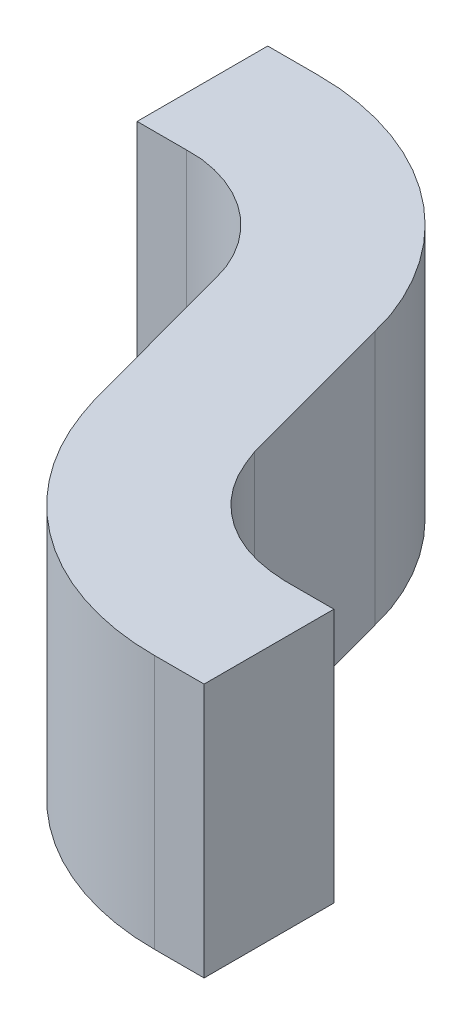
ISO-10303-21;
HEADER;
FILE_DESCRIPTION(('STEP AP214'),'2;1');
FILE_NAME('part.step','',(''),(''),'','','');
FILE_SCHEMA(('AUTOMOTIVE_DESIGN { 1 0 10303 214 1 1 1 1 }'));
ENDSEC;
DATA;
#1=APPLICATION_CONTEXT('core data for automotive mechanical design processes');
#2=APPLICATION_PROTOCOL_DEFINITION('international standard','automotive_design',2000,#1);
#3=PRODUCT_CONTEXT('',#1,'mechanical');
#4=PRODUCT('Part','Part','',(#3));
#5=PRODUCT_RELATED_PRODUCT_CATEGORY('part','',(#4));
#6=PRODUCT_DEFINITION_FORMATION('','',#4);
#7=PRODUCT_DEFINITION_CONTEXT('part definition',#1,'design');
#8=PRODUCT_DEFINITION('design','',#6,#7);
#9=PRODUCT_DEFINITION_SHAPE('','',#8);
#10=(LENGTH_UNIT() NAMED_UNIT(*) SI_UNIT(.MILLI.,.METRE.));
#11=(NAMED_UNIT(*) PLANE_ANGLE_UNIT() SI_UNIT($,.RADIAN.));
#12=(NAMED_UNIT(*) SI_UNIT($,.STERADIAN.) SOLID_ANGLE_UNIT());
#13=UNCERTAINTY_MEASURE_WITH_UNIT(LENGTH_MEASURE(1.E-05),#10,'distance_accuracy_value','');
#14=(GEOMETRIC_REPRESENTATION_CONTEXT(3) GLOBAL_UNCERTAINTY_ASSIGNED_CONTEXT((#13)) GLOBAL_UNIT_ASSIGNED_CONTEXT((#10,
#11,#12)) REPRESENTATION_CONTEXT('',''));
#15=CARTESIAN_POINT('',(0.,0.,0.));
#16=DIRECTION('',(0.,0.,1.));
#17=DIRECTION('',(1.,0.,0.));
#18=AXIS2_PLACEMENT_3D('',#15,#16,#17);
#19=CARTESIAN_POINT('',(-1.054,-0.152,0.543));
#20=DIRECTION('',(1.,0.,0.));
#21=DIRECTION('',(0.,0.,1.));
#22=AXIS2_PLACEMENT_3D('',#19,#20,#21);
#23=PLANE('',#22);
#24=DIRECTION('',(0.,-1.,0.));
#25=VECTOR('',#24,1.);
#26=CARTESIAN_POINT('',(-1.054,0.152,0.543));
#27=LINE('',#26,#25);
#28=CARTESIAN_POINT('',(-1.054,0.152,0.543));
#29=VERTEX_POINT('',#28);
#30=CARTESIAN_POINT('',(-1.054,-0.152,0.543));
#31=VERTEX_POINT('',#30);
#32=EDGE_CURVE('E11',#29,#31,#27,.T.);
#33=ORIENTED_EDGE('',*,*,#32,.F.);
#34=DIRECTION('',(0.,0.,-1.));
#35=VECTOR('',#34,1.);
#36=CARTESIAN_POINT('',(-1.054,0.152,0.698));
#37=LINE('',#36,#35);
#38=CARTESIAN_POINT('',(-1.054,0.152,0.698));
#39=VERTEX_POINT('',#38);
#40=EDGE_CURVE('E24',#39,#29,#37,.T.);
#41=ORIENTED_EDGE('',*,*,#40,.F.);
#42=DIRECTION('',(0.,1.,0.));
#43=VECTOR('',#42,1.);
#44=CARTESIAN_POINT('',(-1.054,-0.152,0.698));
#45=LINE('',#44,#43);
#46=CARTESIAN_POINT('',(-1.054,-0.152,0.698));
#47=VERTEX_POINT('',#46);
#48=EDGE_CURVE('E439',#47,#39,#45,.T.);
#49=ORIENTED_EDGE('',*,*,#48,.F.);
#50=DIRECTION('',(0.,0.,1.));
#51=VECTOR('',#50,1.);
#52=CARTESIAN_POINT('',(-1.054,-0.152,0.543));
#53=LINE('',#52,#51);
#54=EDGE_CURVE('E437',#31,#47,#53,.T.);
#55=ORIENTED_EDGE('',*,*,#54,.F.);
#56=EDGE_LOOP('',(#33,#41,#49,#55));
#57=FACE_BOUND('',#56,.T.);
#58=ADVANCED_FACE('F17',(#57),#23,.T.);
#59=CARTESIAN_POINT('',(-1.054,-0.152,0.698));
#60=DIRECTION('',(0.,0.,1.));
#61=DIRECTION('',(0.,1.,0.));
#62=AXIS2_PLACEMENT_3D('',#59,#60,#61);
#63=PLANE('',#62);
#64=ORIENTED_EDGE('',*,*,#48,.T.);
#65=DIRECTION('',(1.,0.,0.));
#66=VECTOR('',#65,1.);
#67=CARTESIAN_POINT('',(-1.113,0.152,0.698));
#68=LINE('',#67,#66);
#69=CARTESIAN_POINT('',(-1.113,0.152,0.698));
#70=VERTEX_POINT('',#69);
#71=EDGE_CURVE('E435',#70,#39,#68,.T.);
#72=ORIENTED_EDGE('',*,*,#71,.F.);
#73=CARTESIAN_POINT('',(-1.113,-0.152,0.69815));
#74=DIRECTION('',(0.,1.,0.));
#75=VECTOR('',#74,1.);
#76=LINE('',#73,#75);
#77=CARTESIAN_POINT('',(-1.113,-0.152,0.698));
#78=VERTEX_POINT('',#77);
#79=EDGE_CURVE('E257',#78,#70,#76,.T.);
#80=ORIENTED_EDGE('',*,*,#79,.F.);
#81=DIRECTION('',(-1.,0.,0.));
#82=VECTOR('',#81,1.);
#83=CARTESIAN_POINT('',(-1.054,-0.152,0.698));
#84=LINE('',#83,#82);
#85=EDGE_CURVE('E247',#47,#78,#84,.T.);
#86=ORIENTED_EDGE('',*,*,#85,.F.);
#87=EDGE_LOOP('',(#64,#72,#80,#86));
#88=FACE_BOUND('',#87,.T.);
#89=ADVANCED_FACE('F237',(#88),#63,.T.);
#90=CARTESIAN_POINT('',(-1.054,0.152,0.543));
#91=DIRECTION('',(0.,0.,-1.));
#92=DIRECTION('',(0.,1.,0.));
#93=AXIS2_PLACEMENT_3D('',#90,#91,#92);
#94=PLANE('',#93);
#95=ORIENTED_EDGE('',*,*,#32,.T.);
#96=DIRECTION('',(1.,0.,0.));
#97=VECTOR('',#96,1.);
#98=CARTESIAN_POINT('',(-1.113,-0.152,0.543));
#99=LINE('',#98,#97);
#100=CARTESIAN_POINT('',(-1.113,-0.152,0.543));
#101=VERTEX_POINT('',#100);
#102=EDGE_CURVE('E443',#101,#31,#99,.T.);
#103=ORIENTED_EDGE('',*,*,#102,.F.);
#104=CARTESIAN_POINT('',(-1.113,0.152,0.542575));
#105=DIRECTION('',(0.,-1.,0.));
#106=VECTOR('',#105,1.);
#107=LINE('',#104,#106);
#108=CARTESIAN_POINT('',(-1.113,0.152,0.543));
#109=VERTEX_POINT('',#108);
#110=EDGE_CURVE('E222',#109,#101,#107,.T.);
#111=ORIENTED_EDGE('',*,*,#110,.F.);
#112=DIRECTION('',(-1.,0.,0.));
#113=VECTOR('',#112,1.);
#114=CARTESIAN_POINT('',(-1.054,0.152,0.543));
#115=LINE('',#114,#113);
#116=EDGE_CURVE('E219',#29,#109,#115,.T.);
#117=ORIENTED_EDGE('',*,*,#116,.F.);
#118=EDGE_LOOP('',(#95,#103,#111,#117));
#119=FACE_BOUND('',#118,.T.);
#120=ADVANCED_FACE('F228',(#119),#94,.T.);
#121=CARTESIAN_POINT('',(-1.467,0.152,0.271));
#122=DIRECTION('',(-0.965885549343203,0.,0.258969313954337));
#123=DIRECTION('',(0.258969313954337,0.,0.965885549343203));
#124=AXIS2_PLACEMENT_3D('',#121,#122,#123);
#125=PLANE('',#124);
#126=CARTESIAN_POINT('',(-1.46667799927154,-0.152,0.270914133139076));
#127=DIRECTION('',(0.,1.,0.));
#128=VECTOR('',#127,1.);
#129=LINE('',#126,#128);
#130=CARTESIAN_POINT('',(-1.467,-0.152,0.271));
#131=VERTEX_POINT('',#130);
#132=CARTESIAN_POINT('',(-1.467,0.152,0.271));
#133=VERTEX_POINT('',#132);
#134=EDGE_CURVE('E215',#131,#133,#129,.T.);
#135=ORIENTED_EDGE('',*,*,#134,.F.);
#136=CARTESIAN_POINT('',(-1.414,-0.152,0.468));
#137=DIRECTION('',(-0.258969313954337,0.,-0.965885549343202));
#138=VECTOR('',#137,1.);
#139=LINE('',#136,#138);
#140=CARTESIAN_POINT('',(-1.414,-0.152,0.468));
#141=VERTEX_POINT('',#140);
#142=EDGE_CURVE('E301',#141,#131,#139,.T.);
#143=ORIENTED_EDGE('',*,*,#142,.F.);
#144=CARTESIAN_POINT('',(-1.41346097901335,0.152,0.467854947840802));
#145=DIRECTION('',(0.,-1.,0.));
#146=VECTOR('',#145,1.);
#147=LINE('',#144,#146);
#148=CARTESIAN_POINT('',(-1.414,0.152,0.468));
#149=VERTEX_POINT('',#148);
#150=EDGE_CURVE('E288',#149,#141,#147,.T.);
#151=ORIENTED_EDGE('',*,*,#150,.F.);
#152=DIRECTION('',(0.258969313954337,0.,0.965885549343203));
#153=VECTOR('',#152,1.);
#154=CARTESIAN_POINT('',(-1.467,0.152,0.271));
#155=LINE('',#154,#153);
#156=EDGE_CURVE('E356',#133,#149,#155,.T.);
#157=ORIENTED_EDGE('',*,*,#156,.F.);
#158=EDGE_LOOP('',(#135,#143,#151,#157));
#159=FACE_BOUND('',#158,.T.);
#160=ADVANCED_FACE('F236',(#159),#125,.T.);
#161=CARTESIAN_POINT('',(-1.317,-0.152,0.231));
#162=DIRECTION('',(0.965885549343203,0.,-0.258969313954337));
#163=DIRECTION('',(0.258969313954337,0.,0.965885549343203));
#164=AXIS2_PLACEMENT_3D('',#161,#162,#163);
#165=PLANE('',#164);
#166=CARTESIAN_POINT('',(-1.31635599854307,0.152,0.230828266278153));
#167=DIRECTION('',(0.,-1.,0.));
#168=VECTOR('',#167,1.);
#169=LINE('',#166,#168);
#170=CARTESIAN_POINT('',(-1.317,0.152,0.231));
#171=VERTEX_POINT('',#170);
#172=CARTESIAN_POINT('',(-1.317,-0.152,0.231));
#173=VERTEX_POINT('',#172);
#174=EDGE_CURVE('E342',#171,#173,#169,.T.);
#175=ORIENTED_EDGE('',*,*,#174,.F.);
#176=CARTESIAN_POINT('',(-1.264,0.152,0.428));
#177=DIRECTION('',(-0.258969313954337,0.,-0.965885549343202));
#178=VECTOR('',#177,1.);
#179=LINE('',#176,#178);
#180=CARTESIAN_POINT('',(-1.264,0.152,0.428));
#181=VERTEX_POINT('',#180);
#182=EDGE_CURVE('E330',#181,#171,#179,.T.);
#183=ORIENTED_EDGE('',*,*,#182,.F.);
#184=CARTESIAN_POINT('',(-1.2631389278252,-0.152,0.427766198945916));
#185=DIRECTION('',(0.,1.,0.));
#186=VECTOR('',#185,1.);
#187=LINE('',#184,#186);
#188=CARTESIAN_POINT('',(-1.264,-0.152,0.428));
#189=VERTEX_POINT('',#188);
#190=EDGE_CURVE('E366',#189,#181,#187,.T.);
#191=ORIENTED_EDGE('',*,*,#190,.F.);
#192=DIRECTION('',(0.258969313954337,0.,0.965885549343203));
#193=VECTOR('',#192,1.);
#194=CARTESIAN_POINT('',(-1.317,-0.152,0.231));
#195=LINE('',#194,#193);
#196=EDGE_CURVE('E368',#173,#189,#195,.T.);
#197=ORIENTED_EDGE('',*,*,#196,.F.);
#198=EDGE_LOOP('',(#175,#183,#191,#197));
#199=FACE_BOUND('',#198,.T.);
#200=ADVANCED_FACE('F160',(#199),#165,.T.);
#201=CARTESIAN_POINT('',(-1.676,0.152,0.156));
#202=DIRECTION('',(0.,0.,1.));
#203=DIRECTION('',(0.,1.,0.));
#204=AXIS2_PLACEMENT_3D('',#201,#202,#203);
#205=PLANE('',#204);
#206=DIRECTION('',(0.,1.,0.));
#207=VECTOR('',#206,1.);
#208=CARTESIAN_POINT('',(-1.676,-0.152,0.156));
#209=LINE('',#208,#207);
#210=CARTESIAN_POINT('',(-1.676,-0.152,0.156));
#211=VERTEX_POINT('',#210);
#212=CARTESIAN_POINT('',(-1.676,0.152,0.156));
#213=VERTEX_POINT('',#212);
#214=EDGE_CURVE('E125',#211,#213,#209,.T.);
#215=ORIENTED_EDGE('',*,*,#214,.F.);
#216=DIRECTION('',(-1.,0.,0.));
#217=VECTOR('',#216,1.);
#218=CARTESIAN_POINT('',(-1.617,-0.152,0.156));
#219=LINE('',#218,#217);
#220=CARTESIAN_POINT('',(-1.617,-0.152,0.156));
#221=VERTEX_POINT('',#220);
#222=EDGE_CURVE('E377',#221,#211,#219,.T.);
#223=ORIENTED_EDGE('',*,*,#222,.F.);
#224=CARTESIAN_POINT('',(-1.617,0.152,0.155425));
#225=DIRECTION('',(0.,-1.,0.));
#226=VECTOR('',#225,1.);
#227=LINE('',#224,#226);
#228=CARTESIAN_POINT('',(-1.617,0.152,0.156));
#229=VERTEX_POINT('',#228);
#230=EDGE_CURVE('E178',#229,#221,#227,.T.);
#231=ORIENTED_EDGE('',*,*,#230,.F.);
#232=DIRECTION('',(1.,0.,0.));
#233=VECTOR('',#232,1.);
#234=CARTESIAN_POINT('',(-1.676,0.152,0.156));
#235=LINE('',#234,#233);
#236=EDGE_CURVE('E169',#213,#229,#235,.T.);
#237=ORIENTED_EDGE('',*,*,#236,.F.);
#238=EDGE_LOOP('',(#215,#223,#231,#237));
#239=FACE_BOUND('',#238,.T.);
#240=ADVANCED_FACE('F155',(#239),#205,.T.);
#241=CARTESIAN_POINT('',(-1.617,0.152,0.));
#242=DIRECTION('',(0.,0.,-1.));
#243=DIRECTION('',(0.,1.,0.));
#244=AXIS2_PLACEMENT_3D('',#241,#242,#243);
#245=PLANE('',#244);
#246=CARTESIAN_POINT('',(-1.617,-0.152,-0.000149999999999977));
#247=DIRECTION('',(0.,1.,0.));
#248=VECTOR('',#247,1.);
#249=LINE('',#246,#248);
#250=CARTESIAN_POINT('',(-1.617,-0.152,0.));
#251=VERTEX_POINT('',#250);
#252=CARTESIAN_POINT('',(-1.617,0.152,0.));
#253=VERTEX_POINT('',#252);
#254=EDGE_CURVE('E140',#251,#253,#249,.T.);
#255=ORIENTED_EDGE('',*,*,#254,.F.);
#256=DIRECTION('',(1.,0.,0.));
#257=VECTOR('',#256,1.);
#258=CARTESIAN_POINT('',(-1.676,-0.152,0.));
#259=LINE('',#258,#257);
#260=CARTESIAN_POINT('',(-1.676,-0.152,0.));
#261=VERTEX_POINT('',#260);
#262=EDGE_CURVE('E107',#261,#251,#259,.T.);
#263=ORIENTED_EDGE('',*,*,#262,.F.);
#264=DIRECTION('',(0.,-1.,0.));
#265=VECTOR('',#264,1.);
#266=CARTESIAN_POINT('',(-1.676,0.152,0.));
#267=LINE('',#266,#265);
#268=CARTESIAN_POINT('',(-1.676,0.152,0.));
#269=VERTEX_POINT('',#268);
#270=EDGE_CURVE('E101',#269,#261,#267,.T.);
#271=ORIENTED_EDGE('',*,*,#270,.F.);
#272=DIRECTION('',(-1.,0.,0.));
#273=VECTOR('',#272,1.);
#274=CARTESIAN_POINT('',(-1.617,0.152,0.));
#275=LINE('',#274,#273);
#276=EDGE_CURVE('E104',#253,#269,#275,.T.);
#277=ORIENTED_EDGE('',*,*,#276,.F.);
#278=EDGE_LOOP('',(#255,#263,#271,#277));
#279=FACE_BOUND('',#278,.T.);
#280=ADVANCED_FACE('F103',(#279),#245,.T.);
#281=CARTESIAN_POINT('',(-1.676,0.152,0.));
#282=DIRECTION('',(-1.,0.,0.));
#283=DIRECTION('',(0.,0.,1.));
#284=AXIS2_PLACEMENT_3D('',#281,#282,#283);
#285=PLANE('',#284);
#286=ORIENTED_EDGE('',*,*,#270,.T.);
#287=DIRECTION('',(0.,0.,-1.));
#288=VECTOR('',#287,1.);
#289=CARTESIAN_POINT('',(-1.676,-0.152,0.156));
#290=LINE('',#289,#288);
#291=EDGE_CURVE('E122',#211,#261,#290,.T.);
#292=ORIENTED_EDGE('',*,*,#291,.F.);
#293=ORIENTED_EDGE('',*,*,#214,.T.);
#294=DIRECTION('',(0.,0.,1.));
#295=VECTOR('',#294,1.);
#296=CARTESIAN_POINT('',(-1.676,0.152,0.));
#297=LINE('',#296,#295);
#298=EDGE_CURVE('E118',#269,#213,#297,.T.);
#299=ORIENTED_EDGE('',*,*,#298,.F.);
#300=EDGE_LOOP('',(#286,#292,#293,#299));
#301=FACE_BOUND('',#300,.T.);
#302=ADVANCED_FACE('F124',(#301),#285,.T.);
#303=CARTESIAN_POINT('',(-1.113,-0.152,0.387));
#304=DIRECTION('',(0.,-1.,0.));
#305=DIRECTION('',(0.,0.,1.));
#306=AXIS2_PLACEMENT_3D('',#303,#304,#305);
#307=CYLINDRICAL_SURFACE('',#306,0.31115);
#308=ORIENTED_EDGE('',*,*,#79,.T.);
#309=CARTESIAN_POINT('',(-1.113,0.152,0.387));
#310=DIRECTION('',(0.,1.,0.));
#311=DIRECTION('',(0.793107076683516,0.,0.609082231652284));
#312=AXIS2_PLACEMENT_3D('',#309,#310,#311);
#313=CIRCLE('',#312,0.31115);
#314=EDGE_CURVE('E127',#149,#70,#313,.T.);
#315=ORIENTED_EDGE('',*,*,#314,.F.);
#316=ORIENTED_EDGE('',*,*,#150,.T.);
#317=CARTESIAN_POINT('',(-1.113,-0.152,0.387));
#318=DIRECTION('',(0.,-1.,0.));
#319=DIRECTION('',(-0.793107076683516,0.,-0.609082231652284));
#320=AXIS2_PLACEMENT_3D('',#317,#318,#319);
#321=CIRCLE('',#320,0.31115);
#322=EDGE_CURVE('E131',#78,#141,#321,.T.);
#323=ORIENTED_EDGE('',*,*,#322,.F.);
#324=EDGE_LOOP('',(#308,#315,#316,#323));
#325=FACE_BOUND('',#324,.T.);
#326=ADVANCED_FACE('F263',(#325),#307,.T.);
#327=CARTESIAN_POINT('',(-1.113,0.152,0.387));
#328=DIRECTION('',(0.,-1.,0.));
#329=DIRECTION('',(0.,0.,-1.));
#330=AXIS2_PLACEMENT_3D('',#327,#328,#329);
#331=CYLINDRICAL_SURFACE('',#330,0.155575);
#332=ORIENTED_EDGE('',*,*,#110,.T.);
#333=CARTESIAN_POINT('',(-1.113,-0.152,0.387));
#334=DIRECTION('',(0.,1.,0.));
#335=DIRECTION('',(0.793107076683516,0.,0.609082231652284));
#336=AXIS2_PLACEMENT_3D('',#333,#334,#335);
#337=CIRCLE('',#336,0.155575);
#338=EDGE_CURVE('E427',#189,#101,#337,.T.);
#339=ORIENTED_EDGE('',*,*,#338,.F.);
#340=ORIENTED_EDGE('',*,*,#190,.T.);
#341=CARTESIAN_POINT('',(-1.113,0.152,0.387));
#342=DIRECTION('',(0.,-1.,0.));
#343=DIRECTION('',(-0.793107076683516,0.,-0.609082231652284));
#344=AXIS2_PLACEMENT_3D('',#341,#342,#343);
#345=CIRCLE('',#344,0.155575);
#346=EDGE_CURVE('E423',#109,#181,#345,.T.);
#347=ORIENTED_EDGE('',*,*,#346,.F.);
#348=EDGE_LOOP('',(#332,#339,#340,#347));
#349=FACE_BOUND('',#348,.T.);
#350=ADVANCED_FACE('F195',(#349),#331,.F.);
#351=CARTESIAN_POINT('',(-1.617,0.152,0.311));
#352=DIRECTION('',(0.,-1.,0.));
#353=DIRECTION('',(0.,0.,1.));
#354=AXIS2_PLACEMENT_3D('',#351,#352,#353);
#355=CYLINDRICAL_SURFACE('',#354,0.155575);
#356=ORIENTED_EDGE('',*,*,#230,.T.);
#357=CARTESIAN_POINT('',(-1.617,-0.152,0.311));
#358=DIRECTION('',(0.,1.,0.));
#359=DIRECTION('',(-0.793107076683516,0.,-0.609082231652284));
#360=AXIS2_PLACEMENT_3D('',#357,#358,#359);
#361=CIRCLE('',#360,0.155575);
#362=EDGE_CURVE('E418',#131,#221,#361,.T.);
#363=ORIENTED_EDGE('',*,*,#362,.F.);
#364=ORIENTED_EDGE('',*,*,#134,.T.);
#365=CARTESIAN_POINT('',(-1.617,0.152,0.311));
#366=DIRECTION('',(0.,-1.,0.));
#367=DIRECTION('',(0.793107076683516,0.,0.609082231652284));
#368=AXIS2_PLACEMENT_3D('',#365,#366,#367);
#369=CIRCLE('',#368,0.155575);
#370=EDGE_CURVE('E408',#229,#133,#369,.T.);
#371=ORIENTED_EDGE('',*,*,#370,.F.);
#372=EDGE_LOOP('',(#356,#363,#364,#371));
#373=FACE_BOUND('',#372,.T.);
#374=ADVANCED_FACE('F184',(#373),#355,.F.);
#375=CARTESIAN_POINT('',(-1.617,0.152,0.311));
#376=DIRECTION('',(0.,-1.,0.));
#377=DIRECTION('',(0.,0.,-1.));
#378=AXIS2_PLACEMENT_3D('',#375,#376,#377);
#379=CYLINDRICAL_SURFACE('',#378,0.31115);
#380=ORIENTED_EDGE('',*,*,#254,.T.);
#381=CARTESIAN_POINT('',(-1.617,0.152,0.311));
#382=DIRECTION('',(0.,1.,0.));
#383=DIRECTION('',(-0.793107076683516,0.,-0.609082231652284));
#384=AXIS2_PLACEMENT_3D('',#381,#382,#383);
#385=CIRCLE('',#384,0.31115);
#386=EDGE_CURVE('E121',#171,#253,#385,.T.);
#387=ORIENTED_EDGE('',*,*,#386,.F.);
#388=ORIENTED_EDGE('',*,*,#174,.T.);
#389=CARTESIAN_POINT('',(-1.617,-0.152,0.311));
#390=DIRECTION('',(0.,-1.,0.));
#391=DIRECTION('',(0.793107076683516,0.,0.609082231652284));
#392=AXIS2_PLACEMENT_3D('',#389,#390,#391);
#393=CIRCLE('',#392,0.31115);
#394=EDGE_CURVE('E405',#251,#173,#393,.T.);
#395=ORIENTED_EDGE('',*,*,#394,.F.);
#396=EDGE_LOOP('',(#380,#387,#388,#395));
#397=FACE_BOUND('',#396,.T.);
#398=ADVANCED_FACE('F194',(#397),#379,.T.);
#399=CARTESIAN_POINT('',(-1.054,0.152,0.543));
#400=DIRECTION('',(0.,1.,0.));
#401=DIRECTION('',(1.,0.,0.));
#402=AXIS2_PLACEMENT_3D('',#399,#400,#401);
#403=PLANE('',#402);
#404=ORIENTED_EDGE('',*,*,#71,.T.);
#405=ORIENTED_EDGE('',*,*,#40,.T.);
#406=ORIENTED_EDGE('',*,*,#116,.T.);
#407=ORIENTED_EDGE('',*,*,#346,.T.);
#408=ORIENTED_EDGE('',*,*,#182,.T.);
#409=ORIENTED_EDGE('',*,*,#386,.T.);
#410=ORIENTED_EDGE('',*,*,#276,.T.);
#411=ORIENTED_EDGE('',*,*,#298,.T.);
#412=ORIENTED_EDGE('',*,*,#236,.T.);
#413=ORIENTED_EDGE('',*,*,#370,.T.);
#414=ORIENTED_EDGE('',*,*,#156,.T.);
#415=ORIENTED_EDGE('',*,*,#314,.T.);
#416=EDGE_LOOP('',(#404,#405,#406,#407,#408,#409,#410,#411,#412,#413,#414,#415));
#417=FACE_BOUND('',#416,.T.);
#418=ADVANCED_FACE('F116',(#417),#403,.T.);
#419=CARTESIAN_POINT('',(-1.617,-0.152,0.156));
#420=DIRECTION('',(0.,-1.,0.));
#421=DIRECTION('',(1.,0.,0.));
#422=AXIS2_PLACEMENT_3D('',#419,#420,#421);
#423=PLANE('',#422);
#424=ORIENTED_EDGE('',*,*,#102,.T.);
#425=ORIENTED_EDGE('',*,*,#54,.T.);
#426=ORIENTED_EDGE('',*,*,#85,.T.);
#427=ORIENTED_EDGE('',*,*,#322,.T.);
#428=ORIENTED_EDGE('',*,*,#142,.T.);
#429=ORIENTED_EDGE('',*,*,#362,.T.);
#430=ORIENTED_EDGE('',*,*,#222,.T.);
#431=ORIENTED_EDGE('',*,*,#291,.T.);
#432=ORIENTED_EDGE('',*,*,#262,.T.);
#433=ORIENTED_EDGE('',*,*,#394,.T.);
#434=ORIENTED_EDGE('',*,*,#196,.T.);
#435=ORIENTED_EDGE('',*,*,#338,.T.);
#436=EDGE_LOOP('',(#424,#425,#426,#427,#428,#429,#430,#431,#432,#433,#434,#435));
#437=FACE_BOUND('',#436,.T.);
#438=ADVANCED_FACE('F306',(#437),#423,.T.);
#439=CLOSED_SHELL('',(#58,#89,#120,#160,#200,#240,#280,#302,#326,#350,#374,#398,#418,#438));
#440=MANIFOLD_SOLID_BREP('B1',#439);
#441=ADVANCED_BREP_SHAPE_REPRESENTATION('',(#18,#440),#14);
#442=SHAPE_DEFINITION_REPRESENTATION(#9,#441);
ENDSEC;
END-ISO-10303-21;
